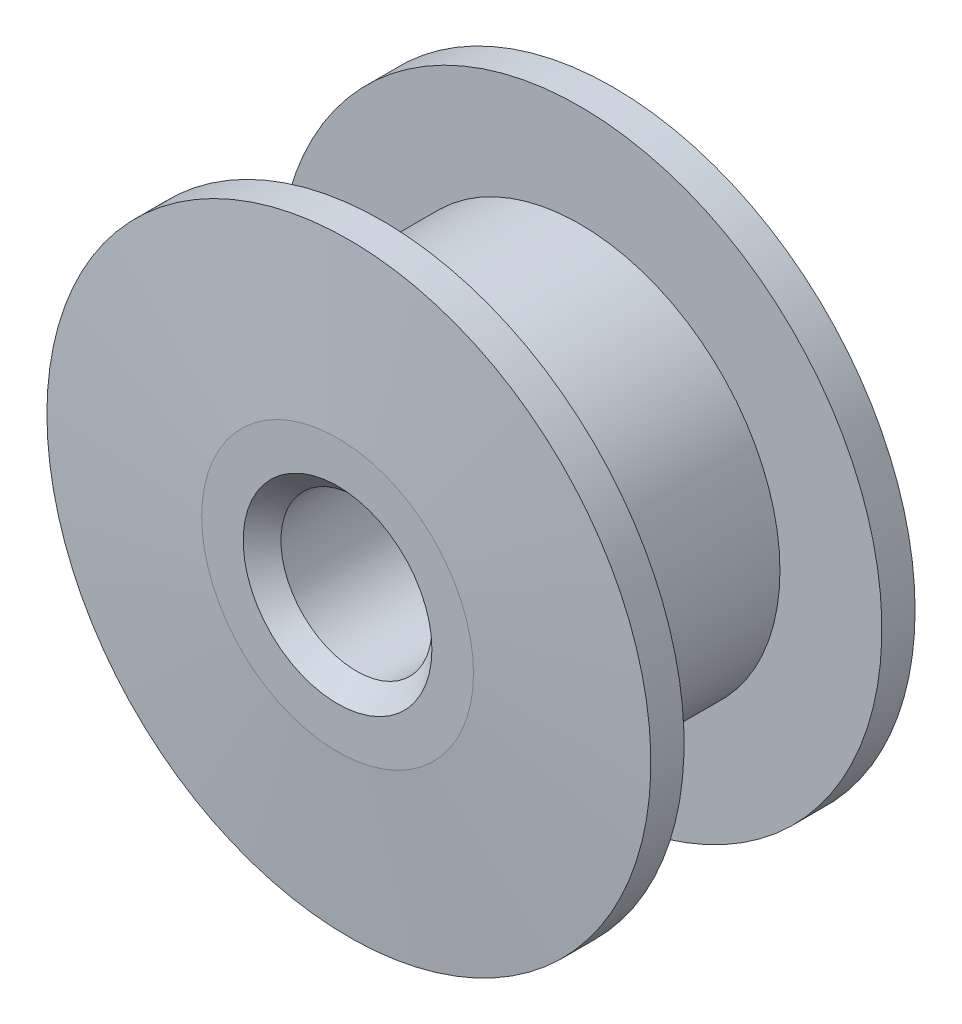
ISO-10303-21;
HEADER;
FILE_DESCRIPTION(('STEP AP214'),'2;1');
FILE_NAME('part.step','',(''),(''),'','','');
FILE_SCHEMA(('AUTOMOTIVE_DESIGN { 1 0 10303 214 1 1 1 1 }'));
ENDSEC;
DATA;
#1=APPLICATION_CONTEXT('core data for automotive mechanical design processes');
#2=APPLICATION_PROTOCOL_DEFINITION('international standard','automotive_design',2000,#1);
#3=PRODUCT_CONTEXT('',#1,'mechanical');
#4=PRODUCT('Part','Part','',(#3));
#5=PRODUCT_RELATED_PRODUCT_CATEGORY('part','',(#4));
#6=PRODUCT_DEFINITION_FORMATION('','',#4);
#7=PRODUCT_DEFINITION_CONTEXT('part definition',#1,'design');
#8=PRODUCT_DEFINITION('design','',#6,#7);
#9=PRODUCT_DEFINITION_SHAPE('','',#8);
#10=(LENGTH_UNIT() NAMED_UNIT(*) SI_UNIT(.MILLI.,.METRE.));
#11=(NAMED_UNIT(*) PLANE_ANGLE_UNIT() SI_UNIT($,.RADIAN.));
#12=(NAMED_UNIT(*) SI_UNIT($,.STERADIAN.) SOLID_ANGLE_UNIT());
#13=UNCERTAINTY_MEASURE_WITH_UNIT(LENGTH_MEASURE(1.E-05),#10,'distance_accuracy_value','');
#14=(GEOMETRIC_REPRESENTATION_CONTEXT(3) GLOBAL_UNCERTAINTY_ASSIGNED_CONTEXT((#13)) GLOBAL_UNIT_ASSIGNED_CONTEXT((#10,
#11,#12)) REPRESENTATION_CONTEXT('',''));
#15=CARTESIAN_POINT('',(0.,0.,0.));
#16=DIRECTION('',(0.,0.,1.));
#17=DIRECTION('',(1.,0.,0.));
#18=AXIS2_PLACEMENT_3D('',#15,#16,#17);
#19=CARTESIAN_POINT('',(0.,0.,1.9));
#20=DIRECTION('',(0.,0.,-1.));
#21=DIRECTION('',(-1.,0.,0.));
#22=AXIS2_PLACEMENT_3D('',#19,#20,#21);
#23=CYLINDRICAL_SURFACE('',#22,4.);
#24=CARTESIAN_POINT('',(0.,0.,-1.75));
#25=DIRECTION('',(0.,0.,1.));
#26=DIRECTION('',(1.,0.,0.));
#27=AXIS2_PLACEMENT_3D('',#24,#25,#26);
#28=CIRCLE('',#27,4.);
#29=CARTESIAN_POINT('',(-4.,0.,-1.75));
#30=VERTEX_POINT('',#29);
#31=EDGE_CURVE('E45',#30,#30,#28,.T.);
#32=CARTESIAN_POINT('',(0.,0.,-1.31));
#33=DIRECTION('',(0.,0.,1.));
#34=DIRECTION('',(1.,0.,0.));
#35=AXIS2_PLACEMENT_3D('',#32,#33,#34);
#36=CIRCLE('',#35,4.);
#37=CARTESIAN_POINT('',(-4.,0.,-1.31));
#38=VERTEX_POINT('',#37);
#39=EDGE_CURVE('E62',#38,#38,#36,.T.);
#40=CARTESIAN_POINT('',(-4.,0.,-1.75));
#41=CARTESIAN_POINT('',(-4.,0.,-1.74541666666667));
#42=CARTESIAN_POINT('',(-4.,0.,-1.74083333333333));
#43=CARTESIAN_POINT('',(-4.,0.,-1.73166666666667));
#44=CARTESIAN_POINT('',(-4.,0.,-1.72708333333333));
#45=CARTESIAN_POINT('',(-4.,0.,-1.71791666666667));
#46=CARTESIAN_POINT('',(-4.,0.,-1.71333333333333));
#47=CARTESIAN_POINT('',(-4.,0.,-1.70416666666667));
#48=CARTESIAN_POINT('',(-4.,0.,-1.69958333333333));
#49=CARTESIAN_POINT('',(-4.,0.,-1.69041666666667));
#50=CARTESIAN_POINT('',(-4.,0.,-1.68583333333333));
#51=CARTESIAN_POINT('',(-4.,0.,-1.67666666666667));
#52=CARTESIAN_POINT('',(-4.,0.,-1.67208333333333));
#53=CARTESIAN_POINT('',(-4.,0.,-1.66291666666667));
#54=CARTESIAN_POINT('',(-4.,0.,-1.65833333333333));
#55=CARTESIAN_POINT('',(-4.,0.,-1.64916666666667));
#56=CARTESIAN_POINT('',(-4.,0.,-1.64458333333333));
#57=CARTESIAN_POINT('',(-4.,0.,-1.63541666666667));
#58=CARTESIAN_POINT('',(-4.,0.,-1.63083333333333));
#59=CARTESIAN_POINT('',(-4.,0.,-1.62166666666667));
#60=CARTESIAN_POINT('',(-4.,0.,-1.61708333333333));
#61=CARTESIAN_POINT('',(-4.,0.,-1.60791666666667));
#62=CARTESIAN_POINT('',(-4.,0.,-1.60333333333333));
#63=CARTESIAN_POINT('',(-4.,0.,-1.59416666666667));
#64=CARTESIAN_POINT('',(-4.,0.,-1.58958333333333));
#65=CARTESIAN_POINT('',(-4.,0.,-1.58041666666667));
#66=CARTESIAN_POINT('',(-4.,0.,-1.57583333333333));
#67=CARTESIAN_POINT('',(-4.,0.,-1.56666666666667));
#68=CARTESIAN_POINT('',(-4.,0.,-1.56208333333333));
#69=CARTESIAN_POINT('',(-4.,0.,-1.55291666666667));
#70=CARTESIAN_POINT('',(-4.,0.,-1.54833333333333));
#71=CARTESIAN_POINT('',(-4.,0.,-1.53916666666667));
#72=CARTESIAN_POINT('',(-4.,0.,-1.53458333333333));
#73=CARTESIAN_POINT('',(-4.,0.,-1.52541666666667));
#74=CARTESIAN_POINT('',(-4.,0.,-1.52083333333333));
#75=CARTESIAN_POINT('',(-4.,0.,-1.51166666666667));
#76=CARTESIAN_POINT('',(-4.,0.,-1.50708333333333));
#77=CARTESIAN_POINT('',(-4.,0.,-1.49791666666667));
#78=CARTESIAN_POINT('',(-4.,0.,-1.49333333333333));
#79=CARTESIAN_POINT('',(-4.,0.,-1.48416666666667));
#80=CARTESIAN_POINT('',(-4.,0.,-1.47958333333333));
#81=CARTESIAN_POINT('',(-4.,0.,-1.47041666666667));
#82=CARTESIAN_POINT('',(-4.,0.,-1.46583333333333));
#83=CARTESIAN_POINT('',(-4.,0.,-1.45666666666667));
#84=CARTESIAN_POINT('',(-4.,0.,-1.45208333333333));
#85=CARTESIAN_POINT('',(-4.,0.,-1.44291666666667));
#86=CARTESIAN_POINT('',(-4.,0.,-1.43833333333333));
#87=CARTESIAN_POINT('',(-4.,0.,-1.42916666666667));
#88=CARTESIAN_POINT('',(-4.,0.,-1.42458333333333));
#89=CARTESIAN_POINT('',(-4.,0.,-1.41541666666667));
#90=CARTESIAN_POINT('',(-4.,0.,-1.41083333333333));
#91=CARTESIAN_POINT('',(-4.,0.,-1.40166666666667));
#92=CARTESIAN_POINT('',(-4.,0.,-1.39708333333333));
#93=CARTESIAN_POINT('',(-4.,0.,-1.38791666666667));
#94=CARTESIAN_POINT('',(-4.,0.,-1.38333333333333));
#95=CARTESIAN_POINT('',(-4.,0.,-1.37416666666667));
#96=CARTESIAN_POINT('',(-4.,0.,-1.36958333333333));
#97=CARTESIAN_POINT('',(-4.,0.,-1.36041666666667));
#98=CARTESIAN_POINT('',(-4.,0.,-1.35583333333333));
#99=CARTESIAN_POINT('',(-4.,0.,-1.34666666666667));
#100=CARTESIAN_POINT('',(-4.,0.,-1.34208333333333));
#101=CARTESIAN_POINT('',(-4.,0.,-1.33291666666667));
#102=CARTESIAN_POINT('',(-4.,0.,-1.32833333333333));
#103=CARTESIAN_POINT('',(-4.,0.,-1.31916666666667));
#104=CARTESIAN_POINT('',(-4.,0.,-1.31458333333333));
#105=CARTESIAN_POINT('',(-4.,0.,-1.31));
#106=B_SPLINE_CURVE_WITH_KNOTS('',3,(#40,#41,#42,#43,#44,#45,#46,#47,#48,#49,#50,#51,#52,#53,
#54,#55,#56,#57,#58,#59,#60,#61,#62,#63,#64,#65,#66,#67,#68,#69,#70,#71,#72,#73,#74,#75,#76,#77,
#78,#79,#80,#81,#82,#83,#84,#85,#86,#87,#88,#89,#90,#91,#92,#93,#94,#95,#96,#97,#98,#99,#100,
#101,#102,#103,#104,#105),.UNSPECIFIED.,.F.,.F.,(4,2,2,2,2,2,2,2,2,2,2,2,2,2,2,2,2,2,2,2,2,2,2,
2,2,2,2,2,2,2,2,2,4),(0.,0.0137499999999999,0.0275000000000002,0.0412500000000001,
0.0549999999999999,0.0687500000000002,0.0825000000000001,0.09625,0.11,0.12375,0.1375,0.15125,
0.165,0.17875,0.1925,0.20625,0.22,0.23375,0.2475,0.26125,0.275,0.28875,0.3025,0.31625,0.33,
0.34375,0.3575,0.37125,0.385,0.39875,0.4125,0.42625,0.44),.UNSPECIFIED.);
#107=EDGE_CURVE('BSEAM30',#30,#38,#106,.T.);
#108=ORIENTED_EDGE('',*,*,#31,.T.);
#109=ORIENTED_EDGE('',*,*,#39,.F.);
#110=ORIENTED_EDGE('',*,*,#107,.T.);
#111=ORIENTED_EDGE('',*,*,#107,.F.);
#112=EDGE_LOOP('',(#108,#110,#109,#111));
#113=FACE_BOUND('',#112,.T.);
#114=ADVANCED_FACE('F30',(#113),#23,.T.);
#115=CARTESIAN_POINT('',(0.,0.,-1.9));
#116=DIRECTION('',(0.,0.,1.));
#117=DIRECTION('',(1.,0.,0.));
#118=AXIS2_PLACEMENT_3D('',#115,#116,#117);
#119=PLANE('',#118);
#120=CARTESIAN_POINT('',(0.,0.,-1.9));
#121=DIRECTION('',(0.,0.,1.));
#122=DIRECTION('',(1.,0.,0.));
#123=AXIS2_PLACEMENT_3D('',#120,#121,#122);
#124=CIRCLE('',#123,1.9999999999999);
#125=CARTESIAN_POINT('',(1.9999999999999,0.,-1.9));
#126=VERTEX_POINT('',#125);
#127=EDGE_CURVE('E41',#126,#126,#124,.F.);
#128=ORIENTED_EDGE('',*,*,#127,.T.);
#129=EDGE_LOOP('',(#128));
#130=FACE_BOUND('',#129,.T.);
#131=CARTESIAN_POINT('',(0.,0.,-1.9));
#132=DIRECTION('',(0.,0.,1.));
#133=DIRECTION('',(1.,0.,0.));
#134=AXIS2_PLACEMENT_3D('',#131,#132,#133);
#135=CIRCLE('',#134,1.25);
#136=CARTESIAN_POINT('',(1.25,0.,-1.9));
#137=VERTEX_POINT('',#136);
#138=EDGE_CURVE('E53',#137,#137,#135,.T.);
#139=ORIENTED_EDGE('',*,*,#138,.T.);
#140=EDGE_LOOP('',(#139));
#141=FACE_BOUND('',#140,.T.);
#142=ADVANCED_FACE('F82',(#130,#141),#119,.F.);
#143=CARTESIAN_POINT('',(0.,0.,-1.31));
#144=DIRECTION('',(0.,0.,1.));
#145=DIRECTION('',(1.,0.,0.));
#146=AXIS2_PLACEMENT_3D('',#143,#144,#145);
#147=PLANE('',#146);
#148=CARTESIAN_POINT('',(0.,0.,-1.31));
#149=DIRECTION('',(0.,0.,1.));
#150=DIRECTION('',(1.,0.,0.));
#151=AXIS2_PLACEMENT_3D('',#148,#149,#150);
#152=CIRCLE('',#151,2.65);
#153=CARTESIAN_POINT('',(2.65,0.,-1.31));
#154=VERTEX_POINT('',#153);
#155=EDGE_CURVE('E66',#154,#154,#152,.T.);
#156=ORIENTED_EDGE('',*,*,#155,.F.);
#157=EDGE_LOOP('',(#156));
#158=FACE_BOUND('',#157,.T.);
#159=ORIENTED_EDGE('',*,*,#39,.T.);
#160=EDGE_LOOP('',(#159));
#161=FACE_BOUND('',#160,.T.);
#162=ADVANCED_FACE('F78',(#158,#161),#147,.T.);
#163=CARTESIAN_POINT('',(0.,0.,1.31));
#164=DIRECTION('',(0.,0.,1.));
#165=DIRECTION('',(1.,0.,0.));
#166=AXIS2_PLACEMENT_3D('',#163,#164,#165);
#167=PLANE('',#166);
#168=CARTESIAN_POINT('',(0.,0.,1.31));
#169=DIRECTION('',(0.,0.,1.));
#170=DIRECTION('',(1.,0.,0.));
#171=AXIS2_PLACEMENT_3D('',#168,#169,#170);
#172=CIRCLE('',#171,2.65);
#173=CARTESIAN_POINT('',(2.65,0.,1.31));
#174=VERTEX_POINT('',#173);
#175=EDGE_CURVE('E69',#174,#174,#172,.T.);
#176=ORIENTED_EDGE('',*,*,#175,.T.);
#177=EDGE_LOOP('',(#176));
#178=FACE_BOUND('',#177,.T.);
#179=CARTESIAN_POINT('',(0.,0.,1.31));
#180=DIRECTION('',(0.,0.,1.));
#181=DIRECTION('',(1.,0.,0.));
#182=AXIS2_PLACEMENT_3D('',#179,#180,#181);
#183=CIRCLE('',#182,4.);
#184=CARTESIAN_POINT('',(-4.,0.,1.31));
#185=VERTEX_POINT('',#184);
#186=EDGE_CURVE('E63',#185,#185,#183,.T.);
#187=ORIENTED_EDGE('',*,*,#186,.F.);
#188=EDGE_LOOP('',(#187));
#189=FACE_BOUND('',#188,.T.);
#190=ADVANCED_FACE('F81',(#178,#189),#167,.F.);
#191=CARTESIAN_POINT('',(0.,0.,-1.31));
#192=DIRECTION('',(0.,0.,1.));
#193=DIRECTION('',(1.,0.,0.));
#194=AXIS2_PLACEMENT_3D('',#191,#192,#193);
#195=CYLINDRICAL_SURFACE('',#194,2.65);
#196=ORIENTED_EDGE('',*,*,#155,.T.);
#197=EDGE_LOOP('',(#196));
#198=FACE_BOUND('',#197,.T.);
#199=ORIENTED_EDGE('',*,*,#175,.F.);
#200=EDGE_LOOP('',(#199));
#201=FACE_BOUND('',#200,.T.);
#202=ADVANCED_FACE('F75',(#198,#201),#195,.T.);
#203=CARTESIAN_POINT('',(0.,0.,1.9));
#204=DIRECTION('',(0.,0.,1.));
#205=DIRECTION('',(1.,0.,0.));
#206=AXIS2_PLACEMENT_3D('',#203,#204,#205);
#207=PLANE('',#206);
#208=CARTESIAN_POINT('',(0.,0.,1.9));
#209=DIRECTION('',(0.,0.,1.));
#210=DIRECTION('',(1.,0.,0.));
#211=AXIS2_PLACEMENT_3D('',#208,#209,#210);
#212=CIRCLE('',#211,1.79999999999989);
#213=CARTESIAN_POINT('',(1.79999999999989,0.,1.9));
#214=VERTEX_POINT('',#213);
#215=EDGE_CURVE('E37',#214,#214,#212,.T.);
#216=ORIENTED_EDGE('',*,*,#215,.T.);
#217=EDGE_LOOP('',(#216));
#218=FACE_BOUND('',#217,.T.);
#219=CARTESIAN_POINT('',(0.,0.,1.9));
#220=DIRECTION('',(0.,0.,1.));
#221=DIRECTION('',(1.,0.,0.));
#222=AXIS2_PLACEMENT_3D('',#219,#220,#221);
#223=CIRCLE('',#222,1.25);
#224=CARTESIAN_POINT('',(1.25,0.,1.9));
#225=VERTEX_POINT('',#224);
#226=EDGE_CURVE('E50',#225,#225,#223,.F.);
#227=ORIENTED_EDGE('',*,*,#226,.T.);
#228=EDGE_LOOP('',(#227));
#229=FACE_BOUND('',#228,.T.);
#230=ADVANCED_FACE('F98',(#218,#229),#207,.T.);
#231=CARTESIAN_POINT('',(0.,0.,1.75));
#232=DIRECTION('',(0.,0.,1.));
#233=DIRECTION('',(1.,0.,0.));
#234=AXIS2_PLACEMENT_3D('',#231,#232,#233);
#235=CIRCLE('',#234,4.);
#236=CARTESIAN_POINT('',(-4.,0.,1.75));
#237=VERTEX_POINT('',#236);
#238=EDGE_CURVE('E10',#237,#237,#235,.F.);
#239=CARTESIAN_POINT('',(-4.,0.,1.75));
#240=CARTESIAN_POINT('',(-4.,0.,1.74541666666667));
#241=CARTESIAN_POINT('',(-4.,0.,1.74083333333333));
#242=CARTESIAN_POINT('',(-4.,0.,1.73166666666667));
#243=CARTESIAN_POINT('',(-4.,0.,1.72708333333333));
#244=CARTESIAN_POINT('',(-4.,0.,1.71791666666667));
#245=CARTESIAN_POINT('',(-4.,0.,1.71333333333333));
#246=CARTESIAN_POINT('',(-4.,0.,1.70416666666667));
#247=CARTESIAN_POINT('',(-4.,0.,1.69958333333333));
#248=CARTESIAN_POINT('',(-4.,0.,1.69041666666667));
#249=CARTESIAN_POINT('',(-4.,0.,1.68583333333333));
#250=CARTESIAN_POINT('',(-4.,0.,1.67666666666667));
#251=CARTESIAN_POINT('',(-4.,0.,1.67208333333333));
#252=CARTESIAN_POINT('',(-4.,0.,1.66291666666667));
#253=CARTESIAN_POINT('',(-4.,0.,1.65833333333333));
#254=CARTESIAN_POINT('',(-4.,0.,1.64916666666667));
#255=CARTESIAN_POINT('',(-4.,0.,1.64458333333333));
#256=CARTESIAN_POINT('',(-4.,0.,1.63541666666667));
#257=CARTESIAN_POINT('',(-4.,0.,1.63083333333333));
#258=CARTESIAN_POINT('',(-4.,0.,1.62166666666667));
#259=CARTESIAN_POINT('',(-4.,0.,1.61708333333333));
#260=CARTESIAN_POINT('',(-4.,0.,1.60791666666667));
#261=CARTESIAN_POINT('',(-4.,0.,1.60333333333333));
#262=CARTESIAN_POINT('',(-4.,0.,1.59416666666667));
#263=CARTESIAN_POINT('',(-4.,0.,1.58958333333333));
#264=CARTESIAN_POINT('',(-4.,0.,1.58041666666667));
#265=CARTESIAN_POINT('',(-4.,0.,1.57583333333333));
#266=CARTESIAN_POINT('',(-4.,0.,1.56666666666667));
#267=CARTESIAN_POINT('',(-4.,0.,1.56208333333333));
#268=CARTESIAN_POINT('',(-4.,0.,1.55291666666667));
#269=CARTESIAN_POINT('',(-4.,0.,1.54833333333333));
#270=CARTESIAN_POINT('',(-4.,0.,1.53916666666667));
#271=CARTESIAN_POINT('',(-4.,0.,1.53458333333333));
#272=CARTESIAN_POINT('',(-4.,0.,1.52541666666667));
#273=CARTESIAN_POINT('',(-4.,0.,1.52083333333333));
#274=CARTESIAN_POINT('',(-4.,0.,1.51166666666667));
#275=CARTESIAN_POINT('',(-4.,0.,1.50708333333333));
#276=CARTESIAN_POINT('',(-4.,0.,1.49791666666667));
#277=CARTESIAN_POINT('',(-4.,0.,1.49333333333333));
#278=CARTESIAN_POINT('',(-4.,0.,1.48416666666667));
#279=CARTESIAN_POINT('',(-4.,0.,1.47958333333333));
#280=CARTESIAN_POINT('',(-4.,0.,1.47041666666667));
#281=CARTESIAN_POINT('',(-4.,0.,1.46583333333333));
#282=CARTESIAN_POINT('',(-4.,0.,1.45666666666667));
#283=CARTESIAN_POINT('',(-4.,0.,1.45208333333333));
#284=CARTESIAN_POINT('',(-4.,0.,1.44291666666667));
#285=CARTESIAN_POINT('',(-4.,0.,1.43833333333333));
#286=CARTESIAN_POINT('',(-4.,0.,1.42916666666667));
#287=CARTESIAN_POINT('',(-4.,0.,1.42458333333333));
#288=CARTESIAN_POINT('',(-4.,0.,1.41541666666667));
#289=CARTESIAN_POINT('',(-4.,0.,1.41083333333333));
#290=CARTESIAN_POINT('',(-4.,0.,1.40166666666667));
#291=CARTESIAN_POINT('',(-4.,0.,1.39708333333333));
#292=CARTESIAN_POINT('',(-4.,0.,1.38791666666667));
#293=CARTESIAN_POINT('',(-4.,0.,1.38333333333333));
#294=CARTESIAN_POINT('',(-4.,0.,1.37416666666667));
#295=CARTESIAN_POINT('',(-4.,0.,1.36958333333333));
#296=CARTESIAN_POINT('',(-4.,0.,1.36041666666667));
#297=CARTESIAN_POINT('',(-4.,0.,1.35583333333333));
#298=CARTESIAN_POINT('',(-4.,0.,1.34666666666667));
#299=CARTESIAN_POINT('',(-4.,0.,1.34208333333333));
#300=CARTESIAN_POINT('',(-4.,0.,1.33291666666667));
#301=CARTESIAN_POINT('',(-4.,0.,1.32833333333333));
#302=CARTESIAN_POINT('',(-4.,0.,1.31916666666667));
#303=CARTESIAN_POINT('',(-4.,0.,1.31458333333333));
#304=CARTESIAN_POINT('',(-4.,0.,1.31));
#305=B_SPLINE_CURVE_WITH_KNOTS('',3,(#239,#240,#241,#242,#243,#244,#245,#246,#247,#248,#249,
#250,#251,#252,#253,#254,#255,#256,#257,#258,#259,#260,#261,#262,#263,#264,#265,#266,#267,#268,
#269,#270,#271,#272,#273,#274,#275,#276,#277,#278,#279,#280,#281,#282,#283,#284,#285,#286,#287,
#288,#289,#290,#291,#292,#293,#294,#295,#296,#297,#298,#299,#300,#301,#302,#303,#304),
.UNSPECIFIED.,.F.,.F.,(4,2,2,2,2,2,2,2,2,2,2,2,2,2,2,2,2,2,2,2,2,2,2,2,2,2,2,2,2,2,2,2,4),(0.,
0.0137500000000001,0.0275000000000002,0.0412500000000001,0.0550000000000001,0.06875,
0.0825000000000001,0.0962500000000002,0.11,0.12375,0.1375,0.15125,0.165,0.17875,0.1925,0.20625,
0.22,0.23375,0.2475,0.26125,0.275,0.28875,0.3025,0.31625,0.33,0.34375,0.3575,0.37125,0.385,
0.39875,0.4125,0.42625,0.44),.UNSPECIFIED.);
#306=EDGE_CURVE('BSEAM89',#237,#185,#305,.T.);
#307=ORIENTED_EDGE('',*,*,#238,.T.);
#308=ORIENTED_EDGE('',*,*,#186,.T.);
#309=ORIENTED_EDGE('',*,*,#306,.T.);
#310=ORIENTED_EDGE('',*,*,#306,.F.);
#311=EDGE_LOOP('',(#307,#309,#308,#310));
#312=FACE_BOUND('',#311,.T.);
#313=ADVANCED_FACE('F89',(#312),#23,.T.);
#314=CARTESIAN_POINT('',(0.,0.,-4.72842712474619));
#315=DIRECTION('',(0.,0.,1.));
#316=DIRECTION('',(1.,0.,0.));
#317=AXIS2_PLACEMENT_3D('',#314,#315,#316);
#318=CYLINDRICAL_SURFACE('',#317,1.);
#319=CARTESIAN_POINT('',(0.,0.,-1.65));
#320=DIRECTION('',(0.,0.,1.));
#321=DIRECTION('',(1.,0.,0.));
#322=AXIS2_PLACEMENT_3D('',#319,#320,#321);
#323=CIRCLE('',#322,1.);
#324=CARTESIAN_POINT('',(1.,0.,-1.65));
#325=VERTEX_POINT('',#324);
#326=EDGE_CURVE('E56',#325,#325,#323,.F.);
#327=ORIENTED_EDGE('',*,*,#326,.T.);
#328=EDGE_LOOP('',(#327));
#329=FACE_BOUND('',#328,.T.);
#330=CARTESIAN_POINT('',(0.,0.,1.65));
#331=DIRECTION('',(0.,0.,1.));
#332=DIRECTION('',(1.,0.,0.));
#333=AXIS2_PLACEMENT_3D('',#330,#331,#332);
#334=CIRCLE('',#333,1.);
#335=CARTESIAN_POINT('',(1.,0.,1.65));
#336=VERTEX_POINT('',#335);
#337=EDGE_CURVE('E59',#336,#336,#334,.T.);
#338=ORIENTED_EDGE('',*,*,#337,.T.);
#339=EDGE_LOOP('',(#338));
#340=FACE_BOUND('',#339,.T.);
#341=ADVANCED_FACE('F97',(#329,#340),#318,.F.);
#342=CARTESIAN_POINT('',(0.,0.,-1.65));
#343=DIRECTION('',(0.,0.,-1.));
#344=DIRECTION('',(-1.,0.,0.));
#345=AXIS2_PLACEMENT_3D('',#342,#343,#344);
#346=CONICAL_SURFACE('',#345,1.,0.785398163397449);
#347=ORIENTED_EDGE('',*,*,#138,.F.);
#348=EDGE_LOOP('',(#347));
#349=FACE_BOUND('',#348,.T.);
#350=ORIENTED_EDGE('',*,*,#326,.F.);
#351=EDGE_LOOP('',(#350));
#352=FACE_BOUND('',#351,.T.);
#353=ADVANCED_FACE('F103',(#349,#352),#346,.F.);
#354=CARTESIAN_POINT('',(0.,0.,1.65));
#355=DIRECTION('',(0.,0.,1.));
#356=DIRECTION('',(1.,0.,0.));
#357=AXIS2_PLACEMENT_3D('',#354,#355,#356);
#358=CONICAL_SURFACE('',#357,1.,0.785398163397454);
#359=ORIENTED_EDGE('',*,*,#226,.F.);
#360=EDGE_LOOP('',(#359));
#361=FACE_BOUND('',#360,.T.);
#362=ORIENTED_EDGE('',*,*,#337,.F.);
#363=EDGE_LOOP('',(#362));
#364=FACE_BOUND('',#363,.T.);
#365=ADVANCED_FACE('F150',(#361,#364),#358,.F.);
#366=CARTESIAN_POINT('',(0.,0.,-1.75));
#367=DIRECTION('',(0.,0.,1.));
#368=DIRECTION('',(1.,0.,0.));
#369=AXIS2_PLACEMENT_3D('',#366,#367,#368);
#370=CONICAL_SURFACE('',#369,4.,1.49593647908413);
#371=ORIENTED_EDGE('',*,*,#127,.F.);
#372=EDGE_LOOP('',(#371));
#373=FACE_BOUND('',#372,.T.);
#374=ORIENTED_EDGE('',*,*,#31,.F.);
#375=EDGE_LOOP('',(#374));
#376=FACE_BOUND('',#375,.T.);
#377=ADVANCED_FACE('F132',(#373,#376),#370,.T.);
#378=CARTESIAN_POINT('',(0.,0.,1.9));
#379=DIRECTION('',(0.,0.,-1.));
#380=DIRECTION('',(-1.,0.,0.));
#381=AXIS2_PLACEMENT_3D('',#378,#379,#380);
#382=CONICAL_SURFACE('',#381,1.79999999999989,1.5027198685369);
#383=ORIENTED_EDGE('',*,*,#238,.F.);
#384=EDGE_LOOP('',(#383));
#385=FACE_BOUND('',#384,.T.);
#386=ORIENTED_EDGE('',*,*,#215,.F.);
#387=EDGE_LOOP('',(#386));
#388=FACE_BOUND('',#387,.T.);
#389=ADVANCED_FACE('F32',(#385,#388),#382,.T.);
#390=CLOSED_SHELL('',(#114,#142,#162,#190,#202,#230,#313,#341,#353,#365,#377,#389));
#391=MANIFOLD_SOLID_BREP('B2',#390);
#392=ADVANCED_BREP_SHAPE_REPRESENTATION('',(#18,#391),#14);
#393=SHAPE_DEFINITION_REPRESENTATION(#9,#392);
ENDSEC;
END-ISO-10303-21;
